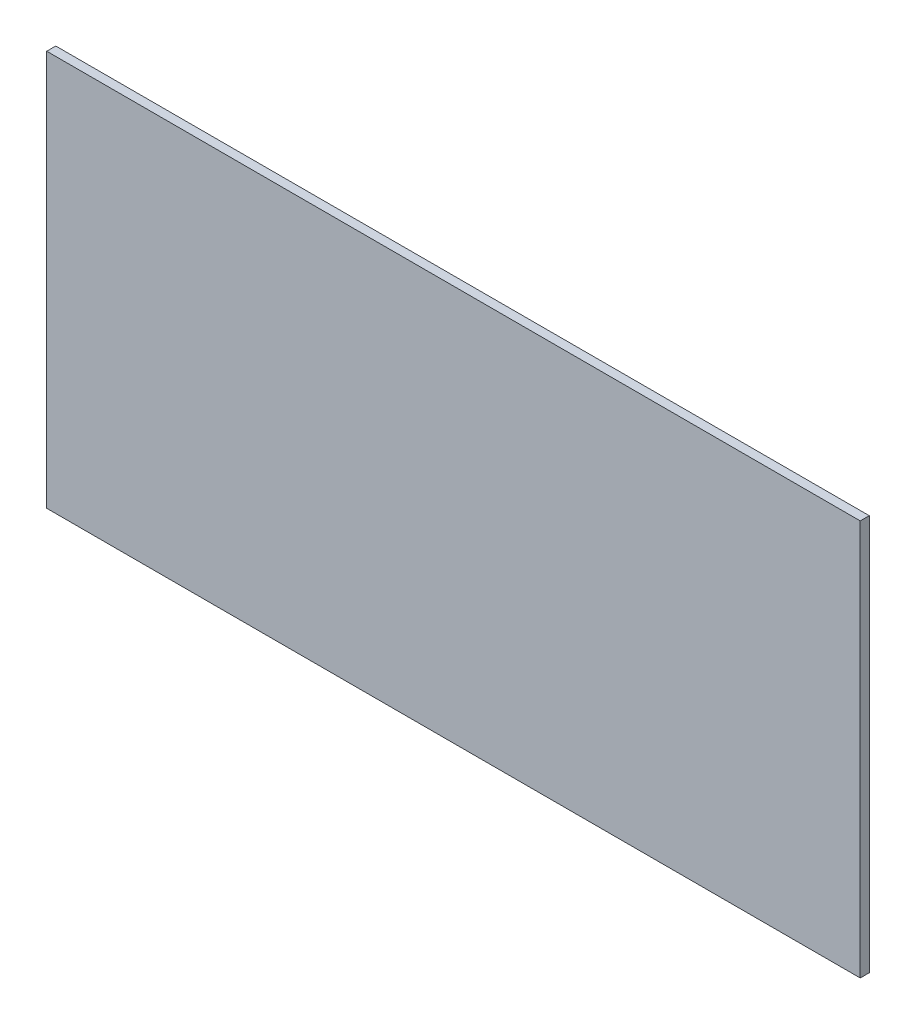
ISO-10303-21;
HEADER;
FILE_DESCRIPTION(('STEP AP214'),'2;1');
FILE_NAME('part.step','',(''),(''),'','','');
FILE_SCHEMA(('AUTOMOTIVE_DESIGN { 1 0 10303 214 1 1 1 1 }'));
ENDSEC;
DATA;
#1=APPLICATION_CONTEXT('core data for automotive mechanical design processes');
#2=APPLICATION_PROTOCOL_DEFINITION('international standard','automotive_design',2000,#1);
#3=PRODUCT_CONTEXT('',#1,'mechanical');
#4=PRODUCT('Part','Part','',(#3));
#5=PRODUCT_RELATED_PRODUCT_CATEGORY('part','',(#4));
#6=PRODUCT_DEFINITION_FORMATION('','',#4);
#7=PRODUCT_DEFINITION_CONTEXT('part definition',#1,'design');
#8=PRODUCT_DEFINITION('design','',#6,#7);
#9=PRODUCT_DEFINITION_SHAPE('','',#8);
#10=(LENGTH_UNIT() NAMED_UNIT(*) SI_UNIT(.MILLI.,.METRE.));
#11=(NAMED_UNIT(*) PLANE_ANGLE_UNIT() SI_UNIT($,.RADIAN.));
#12=(NAMED_UNIT(*) SI_UNIT($,.STERADIAN.) SOLID_ANGLE_UNIT());
#13=UNCERTAINTY_MEASURE_WITH_UNIT(LENGTH_MEASURE(1.E-05),#10,'distance_accuracy_value','');
#14=(GEOMETRIC_REPRESENTATION_CONTEXT(3) GLOBAL_UNCERTAINTY_ASSIGNED_CONTEXT((#13)) GLOBAL_UNIT_ASSIGNED_CONTEXT((#10,
#11,#12)) REPRESENTATION_CONTEXT('',''));
#15=CARTESIAN_POINT('',(0.,0.,0.));
#16=DIRECTION('',(0.,0.,1.));
#17=DIRECTION('',(1.,0.,0.));
#18=AXIS2_PLACEMENT_3D('',#15,#16,#17);
#19=CARTESIAN_POINT('',(142.941176470588,0.,1.5875));
#20=DIRECTION('',(0.,1.,0.));
#21=DIRECTION('',(0.,0.,1.));
#22=AXIS2_PLACEMENT_3D('',#19,#20,#21);
#23=PLANE('',#22);
#24=DIRECTION('',(1.,0.,0.));
#25=VECTOR('',#24,1.);
#26=CARTESIAN_POINT('',(142.941176470588,0.,0.));
#27=LINE('',#26,#25);
#28=CARTESIAN_POINT('',(0.,0.,0.));
#29=VERTEX_POINT('',#28);
#30=CARTESIAN_POINT('',(142.941176470588,0.,0.));
#31=VERTEX_POINT('',#30);
#32=EDGE_CURVE('E100',#29,#31,#27,.T.);
#33=ORIENTED_EDGE('',*,*,#32,.T.);
#34=DIRECTION('',(0.,0.,-1.));
#35=VECTOR('',#34,1.);
#36=CARTESIAN_POINT('',(142.941176470588,0.,1.5875));
#37=LINE('',#36,#35);
#38=CARTESIAN_POINT('',(142.941176470588,0.,1.5875));
#39=VERTEX_POINT('',#38);
#40=EDGE_CURVE('E11',#39,#31,#37,.T.);
#41=ORIENTED_EDGE('',*,*,#40,.F.);
#42=DIRECTION('',(1.,0.,0.));
#43=VECTOR('',#42,1.);
#44=CARTESIAN_POINT('',(142.941176470588,0.,1.5875));
#45=LINE('',#44,#43);
#46=CARTESIAN_POINT('',(0.,0.,1.5875));
#47=VERTEX_POINT('',#46);
#48=EDGE_CURVE('E88',#47,#39,#45,.T.);
#49=ORIENTED_EDGE('',*,*,#48,.F.);
#50=DIRECTION('',(0.,0.,-1.));
#51=VECTOR('',#50,1.);
#52=CARTESIAN_POINT('',(0.,0.,1.5875));
#53=LINE('',#52,#51);
#54=EDGE_CURVE('E96',#47,#29,#53,.T.);
#55=ORIENTED_EDGE('',*,*,#54,.T.);
#56=EDGE_LOOP('',(#33,#41,#49,#55));
#57=FACE_BOUND('',#56,.T.);
#58=ADVANCED_FACE('F37',(#57),#23,.F.);
#59=CARTESIAN_POINT('',(142.941176470588,69.5588235294118,1.5875));
#60=DIRECTION('',(-1.,0.,0.));
#61=DIRECTION('',(0.,0.,1.));
#62=AXIS2_PLACEMENT_3D('',#59,#60,#61);
#63=PLANE('',#62);
#64=DIRECTION('',(0.,1.,0.));
#65=VECTOR('',#64,1.);
#66=CARTESIAN_POINT('',(142.941176470588,69.5588235294118,0.));
#67=LINE('',#66,#65);
#68=CARTESIAN_POINT('',(142.941176470588,69.5588235294118,0.));
#69=VERTEX_POINT('',#68);
#70=EDGE_CURVE('E92',#31,#69,#67,.T.);
#71=ORIENTED_EDGE('',*,*,#70,.T.);
#72=DIRECTION('',(0.,0.,-1.));
#73=VECTOR('',#72,1.);
#74=CARTESIAN_POINT('',(142.941176470588,69.5588235294118,1.5875));
#75=LINE('',#74,#73);
#76=CARTESIAN_POINT('',(142.941176470588,69.5588235294118,1.5875));
#77=VERTEX_POINT('',#76);
#78=EDGE_CURVE('E45',#77,#69,#75,.T.);
#79=ORIENTED_EDGE('',*,*,#78,.F.);
#80=DIRECTION('',(0.,1.,0.));
#81=VECTOR('',#80,1.);
#82=CARTESIAN_POINT('',(142.941176470588,69.5588235294118,1.5875));
#83=LINE('',#82,#81);
#84=EDGE_CURVE('E83',#39,#77,#83,.T.);
#85=ORIENTED_EDGE('',*,*,#84,.F.);
#86=ORIENTED_EDGE('',*,*,#40,.T.);
#87=EDGE_LOOP('',(#71,#79,#85,#86));
#88=FACE_BOUND('',#87,.T.);
#89=ADVANCED_FACE('F91',(#88),#63,.F.);
#90=CARTESIAN_POINT('',(0.,69.5588235294118,1.5875));
#91=DIRECTION('',(0.,-1.,0.));
#92=DIRECTION('',(0.,0.,-1.));
#93=AXIS2_PLACEMENT_3D('',#90,#91,#92);
#94=PLANE('',#93);
#95=DIRECTION('',(-1.,0.,0.));
#96=VECTOR('',#95,1.);
#97=CARTESIAN_POINT('',(0.,69.5588235294118,0.));
#98=LINE('',#97,#96);
#99=CARTESIAN_POINT('',(0.,69.5588235294118,0.));
#100=VERTEX_POINT('',#99);
#101=EDGE_CURVE('E70',#69,#100,#98,.T.);
#102=ORIENTED_EDGE('',*,*,#101,.T.);
#103=DIRECTION('',(0.,0.,-1.));
#104=VECTOR('',#103,1.);
#105=CARTESIAN_POINT('',(0.,69.5588235294118,1.5875));
#106=LINE('',#105,#104);
#107=CARTESIAN_POINT('',(0.,69.5588235294118,1.5875));
#108=VERTEX_POINT('',#107);
#109=EDGE_CURVE('E93',#108,#100,#106,.T.);
#110=ORIENTED_EDGE('',*,*,#109,.F.);
#111=DIRECTION('',(-1.,0.,0.));
#112=VECTOR('',#111,1.);
#113=CARTESIAN_POINT('',(0.,69.5588235294118,1.5875));
#114=LINE('',#113,#112);
#115=EDGE_CURVE('E86',#77,#108,#114,.T.);
#116=ORIENTED_EDGE('',*,*,#115,.F.);
#117=ORIENTED_EDGE('',*,*,#78,.T.);
#118=EDGE_LOOP('',(#102,#110,#116,#117));
#119=FACE_BOUND('',#118,.T.);
#120=ADVANCED_FACE('F94',(#119),#94,.F.);
#121=CARTESIAN_POINT('',(0.,0.,1.5875));
#122=DIRECTION('',(1.,0.,0.));
#123=DIRECTION('',(0.,0.,-1.));
#124=AXIS2_PLACEMENT_3D('',#121,#122,#123);
#125=PLANE('',#124);
#126=DIRECTION('',(0.,-1.,0.));
#127=VECTOR('',#126,1.);
#128=CARTESIAN_POINT('',(0.,0.,0.));
#129=LINE('',#128,#127);
#130=EDGE_CURVE('E76',#100,#29,#129,.T.);
#131=ORIENTED_EDGE('',*,*,#130,.T.);
#132=ORIENTED_EDGE('',*,*,#54,.F.);
#133=DIRECTION('',(0.,-1.,0.));
#134=VECTOR('',#133,1.);
#135=CARTESIAN_POINT('',(0.,0.,1.5875));
#136=LINE('',#135,#134);
#137=EDGE_CURVE('E53',#108,#47,#136,.T.);
#138=ORIENTED_EDGE('',*,*,#137,.F.);
#139=ORIENTED_EDGE('',*,*,#109,.T.);
#140=EDGE_LOOP('',(#131,#132,#138,#139));
#141=FACE_BOUND('',#140,.T.);
#142=ADVANCED_FACE('F107',(#141),#125,.F.);
#143=CARTESIAN_POINT('',(0.,0.,1.5875));
#144=DIRECTION('',(0.,0.,-1.));
#145=DIRECTION('',(-1.,0.,0.));
#146=AXIS2_PLACEMENT_3D('',#143,#144,#145);
#147=PLANE('',#146);
#148=ORIENTED_EDGE('',*,*,#48,.T.);
#149=ORIENTED_EDGE('',*,*,#84,.T.);
#150=ORIENTED_EDGE('',*,*,#115,.T.);
#151=ORIENTED_EDGE('',*,*,#137,.T.);
#152=EDGE_LOOP('',(#148,#149,#150,#151));
#153=FACE_BOUND('',#152,.T.);
#154=ADVANCED_FACE('F84',(#153),#147,.F.);
#155=CARTESIAN_POINT('',(0.,0.,0.));
#156=DIRECTION('',(0.,0.,-1.));
#157=DIRECTION('',(-1.,0.,0.));
#158=AXIS2_PLACEMENT_3D('',#155,#156,#157);
#159=PLANE('',#158);
#160=ORIENTED_EDGE('',*,*,#32,.F.);
#161=ORIENTED_EDGE('',*,*,#130,.F.);
#162=ORIENTED_EDGE('',*,*,#101,.F.);
#163=ORIENTED_EDGE('',*,*,#70,.F.);
#164=EDGE_LOOP('',(#160,#161,#162,#163));
#165=FACE_BOUND('',#164,.T.);
#166=ADVANCED_FACE('F110',(#165),#159,.T.);
#167=CLOSED_SHELL('',(#58,#89,#120,#142,#154,#166));
#168=MANIFOLD_SOLID_BREP('B2',#167);
#169=ADVANCED_BREP_SHAPE_REPRESENTATION('',(#18,#168),#14);
#170=SHAPE_DEFINITION_REPRESENTATION(#9,#169);
ENDSEC;
END-ISO-10303-21;
